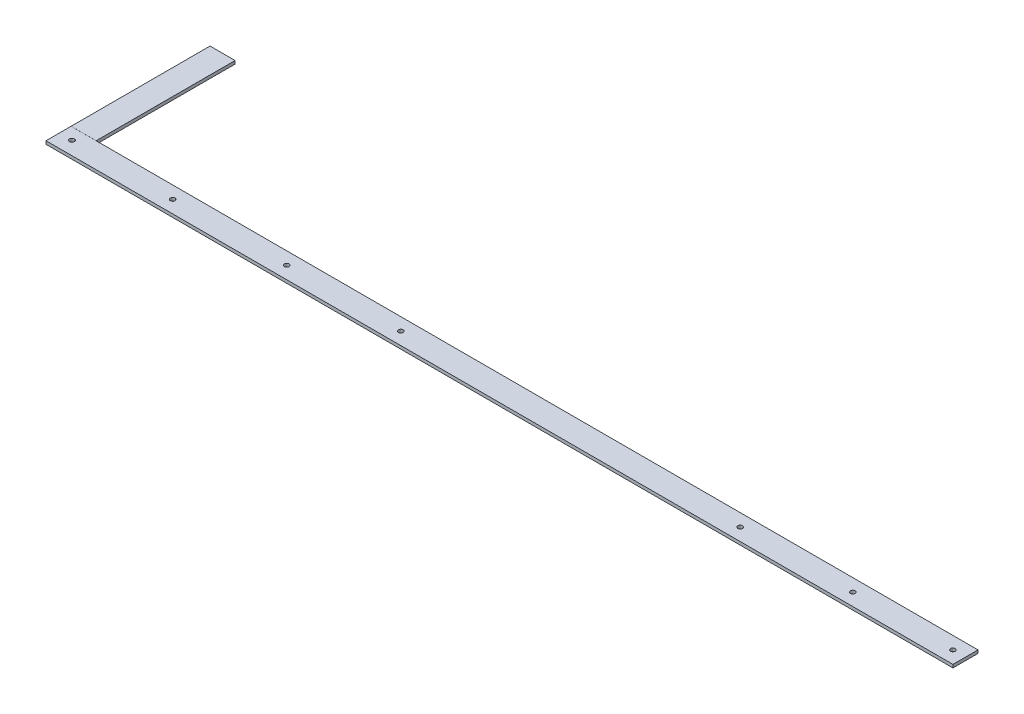
ISO-10303-21;
HEADER;
FILE_DESCRIPTION(('STEP AP214'),'2;1');
FILE_NAME('part.step','',(''),(''),'','','');
FILE_SCHEMA(('AUTOMOTIVE_DESIGN { 1 0 10303 214 1 1 1 1 }'));
ENDSEC;
DATA;
#1=APPLICATION_CONTEXT('core data for automotive mechanical design processes');
#2=APPLICATION_PROTOCOL_DEFINITION('international standard','automotive_design',2000,#1);
#3=PRODUCT_CONTEXT('',#1,'mechanical');
#4=PRODUCT('Part','Part','',(#3));
#5=PRODUCT_RELATED_PRODUCT_CATEGORY('part','',(#4));
#6=PRODUCT_DEFINITION_FORMATION('','',#4);
#7=PRODUCT_DEFINITION_CONTEXT('part definition',#1,'design');
#8=PRODUCT_DEFINITION('design','',#6,#7);
#9=PRODUCT_DEFINITION_SHAPE('','',#8);
#10=(LENGTH_UNIT() NAMED_UNIT(*) SI_UNIT(.MILLI.,.METRE.));
#11=(NAMED_UNIT(*) PLANE_ANGLE_UNIT() SI_UNIT($,.RADIAN.));
#12=(NAMED_UNIT(*) SI_UNIT($,.STERADIAN.) SOLID_ANGLE_UNIT());
#13=UNCERTAINTY_MEASURE_WITH_UNIT(LENGTH_MEASURE(1.E-05),#10,'distance_accuracy_value','');
#14=(GEOMETRIC_REPRESENTATION_CONTEXT(3) GLOBAL_UNCERTAINTY_ASSIGNED_CONTEXT((#13)) GLOBAL_UNIT_ASSIGNED_CONTEXT((#10,
#11,#12)) REPRESENTATION_CONTEXT('',''));
#15=CARTESIAN_POINT('',(0.,0.,0.));
#16=DIRECTION('',(0.,0.,1.));
#17=DIRECTION('',(1.,0.,0.));
#18=AXIS2_PLACEMENT_3D('',#15,#16,#17);
#19=CARTESIAN_POINT('',(-25.4,-64.345,6.31));
#20=DIRECTION('',(0.,1.,0.));
#21=DIRECTION('',(0.,0.,1.));
#22=AXIS2_PLACEMENT_3D('',#19,#20,#21);
#23=PLANE('',#22);
#24=CARTESIAN_POINT('',(1356.13785736519,-64.345,488.04));
#25=DIRECTION('',(0.,1.,0.));
#26=DIRECTION('',(0.,0.,1.));
#27=AXIS2_PLACEMENT_3D('',#24,#25,#26);
#28=CIRCLE('',#27,4.765);
#29=CARTESIAN_POINT('',(1356.13785736519,-64.345,492.805));
#30=VERTEX_POINT('',#29);
#31=EDGE_CURVE('E136',#30,#30,#28,.T.);
#32=ORIENTED_EDGE('',*,*,#31,.T.);
#33=EDGE_LOOP('',(#32));
#34=FACE_BOUND('',#33,.T.);
#35=CARTESIAN_POINT('',(668.331786047783,-64.345,488.04));
#36=DIRECTION('',(0.,1.,0.));
#37=DIRECTION('',(0.,0.,1.));
#38=AXIS2_PLACEMENT_3D('',#35,#36,#37);
#39=CIRCLE('',#38,4.76500000000001);
#40=CARTESIAN_POINT('',(668.331786047783,-64.345,492.805));
#41=VERTEX_POINT('',#40);
#42=EDGE_CURVE('E139',#41,#41,#39,.T.);
#43=ORIENTED_EDGE('',*,*,#42,.T.);
#44=EDGE_LOOP('',(#43));
#45=FACE_BOUND('',#44,.T.);
#46=CARTESIAN_POINT('',(437.087857365189,-64.345,488.04));
#47=DIRECTION('',(0.,1.,0.));
#48=DIRECTION('',(0.,0.,1.));
#49=AXIS2_PLACEMENT_3D('',#46,#47,#48);
#50=CIRCLE('',#49,4.76500000000001);
#51=CARTESIAN_POINT('',(437.087857365189,-64.345,492.805));
#52=VERTEX_POINT('',#51);
#53=EDGE_CURVE('E142',#52,#52,#50,.T.);
#54=ORIENTED_EDGE('',*,*,#53,.T.);
#55=EDGE_LOOP('',(#54));
#56=FACE_BOUND('',#55,.T.);
#57=CARTESIAN_POINT('',(205.843928682594,-64.345,488.04));
#58=DIRECTION('',(0.,1.,0.));
#59=DIRECTION('',(0.,0.,1.));
#60=AXIS2_PLACEMENT_3D('',#57,#58,#59);
#61=CIRCLE('',#60,4.76250000000001);
#62=CARTESIAN_POINT('',(205.843928682594,-64.345,492.8025));
#63=VERTEX_POINT('',#62);
#64=EDGE_CURVE('E145',#63,#63,#61,.T.);
#65=ORIENTED_EDGE('',*,*,#64,.T.);
#66=EDGE_LOOP('',(#65));
#67=FACE_BOUND('',#66,.T.);
#68=CARTESIAN_POINT('',(1584.41892868259,-64.345,488.04));
#69=DIRECTION('',(0.,1.,0.));
#70=DIRECTION('',(0.,0.,1.));
#71=AXIS2_PLACEMENT_3D('',#68,#69,#70);
#72=CIRCLE('',#71,4.765);
#73=CARTESIAN_POINT('',(1584.41892868259,-64.345,492.805));
#74=VERTEX_POINT('',#73);
#75=EDGE_CURVE('E130',#74,#74,#72,.T.);
#76=ORIENTED_EDGE('',*,*,#75,.T.);
#77=EDGE_LOOP('',(#76));
#78=FACE_BOUND('',#77,.T.);
#79=CARTESIAN_POINT('',(0.,-64.345,486.34));
#80=DIRECTION('',(0.,1.,0.));
#81=DIRECTION('',(0.,0.,1.));
#82=AXIS2_PLACEMENT_3D('',#79,#80,#81);
#83=CIRCLE('',#82,5.);
#84=CARTESIAN_POINT('',(0.,-64.345,491.34));
#85=VERTEX_POINT('',#84);
#86=EDGE_CURVE('E124',#85,#85,#83,.T.);
#87=ORIENTED_EDGE('',*,*,#86,.T.);
#88=EDGE_LOOP('',(#87));
#89=FACE_BOUND('',#88,.T.);
#90=CARTESIAN_POINT('',(1787.3,-64.345,488.04));
#91=DIRECTION('',(0.,1.,0.));
#92=DIRECTION('',(0.,0.,1.));
#93=AXIS2_PLACEMENT_3D('',#90,#91,#92);
#94=CIRCLE('',#93,4.7624999999999);
#95=CARTESIAN_POINT('',(1787.3,-64.345,492.8025));
#96=VERTEX_POINT('',#95);
#97=EDGE_CURVE('E118',#96,#96,#94,.T.);
#98=ORIENTED_EDGE('',*,*,#97,.T.);
#99=EDGE_LOOP('',(#98));
#100=FACE_BOUND('',#99,.T.);
#101=DIRECTION('',(0.,0.,-1.));
#102=VECTOR('',#101,1.);
#103=CARTESIAN_POINT('',(-25.4,-64.345,6.31));
#104=LINE('',#103,#102);
#105=CARTESIAN_POINT('',(-25.4,-64.345,513.44));
#106=VERTEX_POINT('',#105);
#107=CARTESIAN_POINT('',(-25.4,-64.345,462.64));
#108=VERTEX_POINT('',#107);
#109=EDGE_CURVE('E48',#106,#108,#104,.T.);
#110=ORIENTED_EDGE('',*,*,#109,.T.);
#111=DIRECTION('',(1.,0.,0.));
#112=VECTOR('',#111,1.);
#113=CARTESIAN_POINT('',(-25.4,-64.345,462.64));
#114=LINE('',#113,#112);
#115=CARTESIAN_POINT('',(1812.7,-64.3449999999998,462.64));
#116=VERTEX_POINT('',#115);
#117=EDGE_CURVE('E61',#108,#116,#114,.T.);
#118=ORIENTED_EDGE('',*,*,#117,.T.);
#119=DIRECTION('',(0.,0.,-1.));
#120=VECTOR('',#119,1.);
#121=CARTESIAN_POINT('',(1812.7,-64.3449999999998,462.64));
#122=LINE('',#121,#120);
#123=CARTESIAN_POINT('',(1812.7,-64.3449999999998,513.44));
#124=VERTEX_POINT('',#123);
#125=EDGE_CURVE('E105',#124,#116,#122,.T.);
#126=ORIENTED_EDGE('',*,*,#125,.F.);
#127=DIRECTION('',(-1.,0.,0.));
#128=VECTOR('',#127,1.);
#129=CARTESIAN_POINT('',(-25.4,-64.345,513.44));
#130=LINE('',#129,#128);
#131=EDGE_CURVE('E94',#124,#106,#130,.T.);
#132=ORIENTED_EDGE('',*,*,#131,.T.);
#133=EDGE_LOOP('',(#110,#118,#126,#132));
#134=FACE_BOUND('',#133,.T.);
#135=ADVANCED_FACE('F45',(#34,#45,#56,#67,#78,#89,#100,#134),#23,.F.);
#136=CARTESIAN_POINT('',(-25.4,-58.035,513.44));
#137=DIRECTION('',(0.,-1.,0.));
#138=DIRECTION('',(0.,0.,-1.));
#139=AXIS2_PLACEMENT_3D('',#136,#137,#138);
#140=PLANE('',#139);
#141=CARTESIAN_POINT('',(1356.13785736519,-58.035,488.04));
#142=DIRECTION('',(0.,1.,0.));
#143=DIRECTION('',(0.,0.,1.));
#144=AXIS2_PLACEMENT_3D('',#141,#142,#143);
#145=CIRCLE('',#144,4.765);
#146=CARTESIAN_POINT('',(1356.13785736519,-58.035,492.805));
#147=VERTEX_POINT('',#146);
#148=EDGE_CURVE('E148',#147,#147,#145,.T.);
#149=ORIENTED_EDGE('',*,*,#148,.F.);
#150=EDGE_LOOP('',(#149));
#151=FACE_BOUND('',#150,.T.);
#152=CARTESIAN_POINT('',(668.331786047783,-58.035,488.04));
#153=DIRECTION('',(0.,1.,0.));
#154=DIRECTION('',(0.,0.,1.));
#155=AXIS2_PLACEMENT_3D('',#152,#153,#154);
#156=CIRCLE('',#155,4.76500000000001);
#157=CARTESIAN_POINT('',(668.331786047783,-58.035,492.805));
#158=VERTEX_POINT('',#157);
#159=EDGE_CURVE('E155',#158,#158,#156,.T.);
#160=ORIENTED_EDGE('',*,*,#159,.F.);
#161=EDGE_LOOP('',(#160));
#162=FACE_BOUND('',#161,.T.);
#163=CARTESIAN_POINT('',(437.087857365189,-58.035,488.04));
#164=DIRECTION('',(0.,1.,0.));
#165=DIRECTION('',(0.,0.,1.));
#166=AXIS2_PLACEMENT_3D('',#163,#164,#165);
#167=CIRCLE('',#166,4.76500000000001);
#168=CARTESIAN_POINT('',(437.087857365189,-58.035,492.805));
#169=VERTEX_POINT('',#168);
#170=EDGE_CURVE('E152',#169,#169,#167,.T.);
#171=ORIENTED_EDGE('',*,*,#170,.F.);
#172=EDGE_LOOP('',(#171));
#173=FACE_BOUND('',#172,.T.);
#174=CARTESIAN_POINT('',(205.843928682594,-58.035,488.04));
#175=DIRECTION('',(0.,1.,0.));
#176=DIRECTION('',(0.,0.,1.));
#177=AXIS2_PLACEMENT_3D('',#174,#175,#176);
#178=CIRCLE('',#177,4.76250000000001);
#179=CARTESIAN_POINT('',(205.843928682594,-58.035,492.8025));
#180=VERTEX_POINT('',#179);
#181=EDGE_CURVE('E149',#180,#180,#178,.T.);
#182=ORIENTED_EDGE('',*,*,#181,.F.);
#183=EDGE_LOOP('',(#182));
#184=FACE_BOUND('',#183,.T.);
#185=CARTESIAN_POINT('',(1584.41892868259,-58.035,488.04));
#186=DIRECTION('',(0.,1.,0.));
#187=DIRECTION('',(0.,0.,1.));
#188=AXIS2_PLACEMENT_3D('',#185,#186,#187);
#189=CIRCLE('',#188,4.765);
#190=CARTESIAN_POINT('',(1584.41892868259,-58.035,492.805));
#191=VERTEX_POINT('',#190);
#192=EDGE_CURVE('E133',#191,#191,#189,.T.);
#193=ORIENTED_EDGE('',*,*,#192,.F.);
#194=EDGE_LOOP('',(#193));
#195=FACE_BOUND('',#194,.T.);
#196=CARTESIAN_POINT('',(0.,-58.035,486.34));
#197=DIRECTION('',(0.,1.,0.));
#198=DIRECTION('',(0.,0.,1.));
#199=AXIS2_PLACEMENT_3D('',#196,#197,#198);
#200=CIRCLE('',#199,5.);
#201=CARTESIAN_POINT('',(0.,-58.035,491.34));
#202=VERTEX_POINT('',#201);
#203=EDGE_CURVE('E127',#202,#202,#200,.T.);
#204=ORIENTED_EDGE('',*,*,#203,.F.);
#205=EDGE_LOOP('',(#204));
#206=FACE_BOUND('',#205,.T.);
#207=CARTESIAN_POINT('',(1787.3,-58.035,488.04));
#208=DIRECTION('',(0.,1.,0.));
#209=DIRECTION('',(0.,0.,1.));
#210=AXIS2_PLACEMENT_3D('',#207,#208,#209);
#211=CIRCLE('',#210,4.7624999999999);
#212=CARTESIAN_POINT('',(1787.3,-58.035,492.8025));
#213=VERTEX_POINT('',#212);
#214=EDGE_CURVE('E121',#213,#213,#211,.T.);
#215=ORIENTED_EDGE('',*,*,#214,.F.);
#216=EDGE_LOOP('',(#215));
#217=FACE_BOUND('',#216,.T.);
#218=DIRECTION('',(-1.,0.,0.));
#219=VECTOR('',#218,1.);
#220=CARTESIAN_POINT('',(1812.7,-58.0349999999998,462.64));
#221=LINE('',#220,#219);
#222=CARTESIAN_POINT('',(1812.7,-58.0349999999998,462.64));
#223=VERTEX_POINT('',#222);
#224=CARTESIAN_POINT('',(-25.4,-58.035,462.64));
#225=VERTEX_POINT('',#224);
#226=EDGE_CURVE('E110',#223,#225,#221,.T.);
#227=ORIENTED_EDGE('',*,*,#226,.T.);
#228=DIRECTION('',(0.,0.,-1.));
#229=VECTOR('',#228,1.);
#230=CARTESIAN_POINT('',(-25.4,-58.035,513.44));
#231=LINE('',#230,#229);
#232=CARTESIAN_POINT('',(-25.4,-58.035,513.44));
#233=VERTEX_POINT('',#232);
#234=EDGE_CURVE('E88',#233,#225,#231,.T.);
#235=ORIENTED_EDGE('',*,*,#234,.F.);
#236=DIRECTION('',(-1.,0.,0.));
#237=VECTOR('',#236,1.);
#238=CARTESIAN_POINT('',(-25.4,-58.035,513.44));
#239=LINE('',#238,#237);
#240=CARTESIAN_POINT('',(1812.7,-58.035,513.44));
#241=VERTEX_POINT('',#240);
#242=EDGE_CURVE('E12',#241,#233,#239,.T.);
#243=ORIENTED_EDGE('',*,*,#242,.F.);
#244=DIRECTION('',(0.,0.,1.));
#245=VECTOR('',#244,1.);
#246=CARTESIAN_POINT('',(1812.7,-58.0349999999998,462.64));
#247=LINE('',#246,#245);
#248=EDGE_CURVE('E86',#223,#241,#247,.T.);
#249=ORIENTED_EDGE('',*,*,#248,.F.);
#250=EDGE_LOOP('',(#227,#235,#243,#249));
#251=FACE_BOUND('',#250,.T.);
#252=ADVANCED_FACE('F84',(#151,#162,#173,#184,#195,#206,#217,#251),#140,.F.);
#253=CARTESIAN_POINT('',(-25.4,64.345,6.31));
#254=DIRECTION('',(1.,0.,0.));
#255=DIRECTION('',(0.,1.,0.));
#256=AXIS2_PLACEMENT_3D('',#253,#254,#255);
#257=PLANE('',#256);
#258=ORIENTED_EDGE('',*,*,#234,.T.);
#259=DIRECTION('',(0.,-1.,0.));
#260=VECTOR('',#259,1.);
#261=CARTESIAN_POINT('',(-25.4,64.345,462.64));
#262=LINE('',#261,#260);
#263=EDGE_CURVE('E113',#225,#108,#262,.T.);
#264=ORIENTED_EDGE('',*,*,#263,.T.);
#265=ORIENTED_EDGE('',*,*,#109,.F.);
#266=DIRECTION('',(0.,-1.,0.));
#267=VECTOR('',#266,1.);
#268=CARTESIAN_POINT('',(-25.4,-58.035,513.44));
#269=LINE('',#268,#267);
#270=EDGE_CURVE('E98',#233,#106,#269,.T.);
#271=ORIENTED_EDGE('',*,*,#270,.F.);
#272=EDGE_LOOP('',(#258,#264,#265,#271));
#273=FACE_BOUND('',#272,.T.);
#274=ADVANCED_FACE('F166',(#273),#257,.F.);
#275=CARTESIAN_POINT('',(1812.7,1.97302717093577E-13,0.));
#276=DIRECTION('',(1.,0.,0.));
#277=DIRECTION('',(0.,0.,-1.));
#278=AXIS2_PLACEMENT_3D('',#275,#276,#277);
#279=PLANE('',#278);
#280=DIRECTION('',(0.,1.,0.));
#281=VECTOR('',#280,1.);
#282=CARTESIAN_POINT('',(1812.7,-108.835,513.44));
#283=LINE('',#282,#281);
#284=EDGE_CURVE('E54',#124,#241,#283,.T.);
#285=ORIENTED_EDGE('',*,*,#284,.F.);
#286=ORIENTED_EDGE('',*,*,#125,.T.);
#287=DIRECTION('',(0.,1.,0.));
#288=VECTOR('',#287,1.);
#289=CARTESIAN_POINT('',(1812.7,-64.3449999999998,462.64));
#290=LINE('',#289,#288);
#291=EDGE_CURVE('E101',#116,#223,#290,.T.);
#292=ORIENTED_EDGE('',*,*,#291,.T.);
#293=ORIENTED_EDGE('',*,*,#248,.T.);
#294=EDGE_LOOP('',(#285,#286,#292,#293));
#295=FACE_BOUND('',#294,.T.);
#296=ADVANCED_FACE('F100',(#295),#279,.T.);
#297=CARTESIAN_POINT('',(0.,0.,513.44));
#298=DIRECTION('',(0.,0.,1.));
#299=DIRECTION('',(1.,0.,0.));
#300=AXIS2_PLACEMENT_3D('',#297,#298,#299);
#301=PLANE('',#300);
#302=ORIENTED_EDGE('',*,*,#270,.T.);
#303=ORIENTED_EDGE('',*,*,#131,.F.);
#304=ORIENTED_EDGE('',*,*,#284,.T.);
#305=ORIENTED_EDGE('',*,*,#242,.T.);
#306=EDGE_LOOP('',(#302,#303,#304,#305));
#307=FACE_BOUND('',#306,.T.);
#308=ADVANCED_FACE('F93',(#307),#301,.T.);
#309=CARTESIAN_POINT('',(1812.7,-64.3449999999998,462.64));
#310=DIRECTION('',(0.,0.,1.));
#311=DIRECTION('',(1.,0.,0.));
#312=AXIS2_PLACEMENT_3D('',#309,#310,#311);
#313=PLANE('',#312);
#314=ORIENTED_EDGE('',*,*,#291,.F.);
#315=ORIENTED_EDGE('',*,*,#117,.F.);
#316=ORIENTED_EDGE('',*,*,#263,.F.);
#317=ORIENTED_EDGE('',*,*,#226,.F.);
#318=EDGE_LOOP('',(#314,#315,#316,#317));
#319=FACE_BOUND('',#318,.T.);
#320=ADVANCED_FACE('F183',(#319),#313,.F.);
#321=CARTESIAN_POINT('',(1787.3,-91.035,488.04));
#322=DIRECTION('',(0.,1.,0.));
#323=DIRECTION('',(0.,0.,1.));
#324=AXIS2_PLACEMENT_3D('',#321,#322,#323);
#325=CYLINDRICAL_SURFACE('',#324,4.7624999999999);
#326=ORIENTED_EDGE('',*,*,#214,.T.);
#327=EDGE_LOOP('',(#326));
#328=FACE_BOUND('',#327,.T.);
#329=ORIENTED_EDGE('',*,*,#97,.F.);
#330=EDGE_LOOP('',(#329));
#331=FACE_BOUND('',#330,.T.);
#332=ADVANCED_FACE('F179',(#328,#331),#325,.F.);
#333=CARTESIAN_POINT('',(0.,-108.035,486.34));
#334=DIRECTION('',(0.,1.,0.));
#335=DIRECTION('',(0.,0.,1.));
#336=AXIS2_PLACEMENT_3D('',#333,#334,#335);
#337=CYLINDRICAL_SURFACE('',#336,5.);
#338=ORIENTED_EDGE('',*,*,#203,.T.);
#339=EDGE_LOOP('',(#338));
#340=FACE_BOUND('',#339,.T.);
#341=ORIENTED_EDGE('',*,*,#86,.F.);
#342=EDGE_LOOP('',(#341));
#343=FACE_BOUND('',#342,.T.);
#344=ADVANCED_FACE('F182',(#340,#343),#337,.F.);
#345=CARTESIAN_POINT('',(1584.41892868259,-68.035,488.04));
#346=DIRECTION('',(0.,1.,0.));
#347=DIRECTION('',(0.,0.,1.));
#348=AXIS2_PLACEMENT_3D('',#345,#346,#347);
#349=CYLINDRICAL_SURFACE('',#348,4.765);
#350=ORIENTED_EDGE('',*,*,#192,.T.);
#351=EDGE_LOOP('',(#350));
#352=FACE_BOUND('',#351,.T.);
#353=ORIENTED_EDGE('',*,*,#75,.F.);
#354=EDGE_LOOP('',(#353));
#355=FACE_BOUND('',#354,.T.);
#356=ADVANCED_FACE('F203',(#352,#355),#349,.F.);
#357=CARTESIAN_POINT('',(205.843928682594,-68.035,488.04));
#358=DIRECTION('',(0.,1.,0.));
#359=DIRECTION('',(0.,0.,1.));
#360=AXIS2_PLACEMENT_3D('',#357,#358,#359);
#361=CYLINDRICAL_SURFACE('',#360,4.76250000000001);
#362=ORIENTED_EDGE('',*,*,#181,.T.);
#363=EDGE_LOOP('',(#362));
#364=FACE_BOUND('',#363,.T.);
#365=ORIENTED_EDGE('',*,*,#64,.F.);
#366=EDGE_LOOP('',(#365));
#367=FACE_BOUND('',#366,.T.);
#368=ADVANCED_FACE('F207',(#364,#367),#361,.F.);
#369=CARTESIAN_POINT('',(437.087857365189,-68.035,488.04));
#370=DIRECTION('',(0.,1.,0.));
#371=DIRECTION('',(0.,0.,1.));
#372=AXIS2_PLACEMENT_3D('',#369,#370,#371);
#373=CYLINDRICAL_SURFACE('',#372,4.76500000000001);
#374=ORIENTED_EDGE('',*,*,#170,.T.);
#375=EDGE_LOOP('',(#374));
#376=FACE_BOUND('',#375,.T.);
#377=ORIENTED_EDGE('',*,*,#53,.F.);
#378=EDGE_LOOP('',(#377));
#379=FACE_BOUND('',#378,.T.);
#380=ADVANCED_FACE('F211',(#376,#379),#373,.F.);
#381=CARTESIAN_POINT('',(668.331786047783,-68.035,488.04));
#382=DIRECTION('',(0.,1.,0.));
#383=DIRECTION('',(0.,0.,1.));
#384=AXIS2_PLACEMENT_3D('',#381,#382,#383);
#385=CYLINDRICAL_SURFACE('',#384,4.76500000000001);
#386=ORIENTED_EDGE('',*,*,#159,.T.);
#387=EDGE_LOOP('',(#386));
#388=FACE_BOUND('',#387,.T.);
#389=ORIENTED_EDGE('',*,*,#42,.F.);
#390=EDGE_LOOP('',(#389));
#391=FACE_BOUND('',#390,.T.);
#392=ADVANCED_FACE('F215',(#388,#391),#385,.F.);
#393=CARTESIAN_POINT('',(1356.13785736519,-68.035,488.04));
#394=DIRECTION('',(0.,1.,0.));
#395=DIRECTION('',(0.,0.,1.));
#396=AXIS2_PLACEMENT_3D('',#393,#394,#395);
#397=CYLINDRICAL_SURFACE('',#396,4.765);
#398=ORIENTED_EDGE('',*,*,#148,.T.);
#399=EDGE_LOOP('',(#398));
#400=FACE_BOUND('',#399,.T.);
#401=ORIENTED_EDGE('',*,*,#31,.F.);
#402=EDGE_LOOP('',(#401));
#403=FACE_BOUND('',#402,.T.);
#404=ADVANCED_FACE('F161',(#400,#403),#397,.F.);
#405=CLOSED_SHELL('',(#135,#252,#274,#296,#308,#320,#332,#344,#356,#368,#380,#392,#404));
#406=MANIFOLD_SOLID_BREP('B2',#405);
#407=CARTESIAN_POINT('',(25.4,64.345,6.31));
#408=DIRECTION('',(-1.,0.,0.));
#409=DIRECTION('',(0.,-1.,0.));
#410=AXIS2_PLACEMENT_3D('',#407,#408,#409);
#411=PLANE('',#410);
#412=DIRECTION('',(0.,0.,-1.));
#413=VECTOR('',#412,1.);
#414=CARTESIAN_POINT('',(25.4,-64.345,6.31));
#415=LINE('',#414,#413);
#416=CARTESIAN_POINT('',(25.4,-64.345,462.54));
#417=VERTEX_POINT('',#416);
#418=CARTESIAN_POINT('',(25.4,-64.345,181.));
#419=VERTEX_POINT('',#418);
#420=EDGE_CURVE('E405',#417,#419,#415,.T.);
#421=ORIENTED_EDGE('',*,*,#420,.T.);
#422=DIRECTION('',(0.,1.,0.));
#423=VECTOR('',#422,1.);
#424=CARTESIAN_POINT('',(25.4,-132.035,181.));
#425=LINE('',#424,#423);
#426=CARTESIAN_POINT('',(25.4,-58.035,181.));
#427=VERTEX_POINT('',#426);
#428=EDGE_CURVE('E364',#419,#427,#425,.T.);
#429=ORIENTED_EDGE('',*,*,#428,.T.);
#430=DIRECTION('',(0.,0.,-1.));
#431=VECTOR('',#430,1.);
#432=CARTESIAN_POINT('',(25.4,-58.035,513.44));
#433=LINE('',#432,#431);
#434=CARTESIAN_POINT('',(25.4,-58.035,462.54));
#435=VERTEX_POINT('',#434);
#436=EDGE_CURVE('E402',#435,#427,#433,.T.);
#437=ORIENTED_EDGE('',*,*,#436,.F.);
#438=DIRECTION('',(0.,1.,0.));
#439=VECTOR('',#438,1.);
#440=CARTESIAN_POINT('',(25.4,-108.835,462.54));
#441=LINE('',#440,#439);
#442=EDGE_CURVE('E416',#417,#435,#441,.T.);
#443=ORIENTED_EDGE('',*,*,#442,.F.);
#444=EDGE_LOOP('',(#421,#429,#437,#443));
#445=FACE_BOUND('',#444,.T.);
#446=ADVANCED_FACE('F349',(#445),#411,.F.);
#447=CARTESIAN_POINT('',(-25.4,64.345,6.31));
#448=DIRECTION('',(1.,0.,0.));
#449=DIRECTION('',(0.,1.,0.));
#450=AXIS2_PLACEMENT_3D('',#447,#448,#449);
#451=PLANE('',#450);
#452=DIRECTION('',(0.,0.,-1.));
#453=VECTOR('',#452,1.);
#454=CARTESIAN_POINT('',(-25.4,-58.035,513.44));
#455=LINE('',#454,#453);
#456=CARTESIAN_POINT('',(-25.4,-58.035,462.54));
#457=VERTEX_POINT('',#456);
#458=CARTESIAN_POINT('',(-25.4,-58.035,181.));
#459=VERTEX_POINT('',#458);
#460=EDGE_CURVE('E400',#457,#459,#455,.T.);
#461=ORIENTED_EDGE('',*,*,#460,.T.);
#462=DIRECTION('',(0.,1.,0.));
#463=VECTOR('',#462,1.);
#464=CARTESIAN_POINT('',(-25.4,-132.035,181.));
#465=LINE('',#464,#463);
#466=CARTESIAN_POINT('',(-25.4,-64.345,181.));
#467=VERTEX_POINT('',#466);
#468=EDGE_CURVE('E387',#467,#459,#465,.T.);
#469=ORIENTED_EDGE('',*,*,#468,.F.);
#470=DIRECTION('',(0.,0.,-1.));
#471=VECTOR('',#470,1.);
#472=CARTESIAN_POINT('',(-25.4,-64.345,6.31));
#473=LINE('',#472,#471);
#474=CARTESIAN_POINT('',(-25.4,-64.345,462.54));
#475=VERTEX_POINT('',#474);
#476=EDGE_CURVE('E410',#475,#467,#473,.T.);
#477=ORIENTED_EDGE('',*,*,#476,.F.);
#478=DIRECTION('',(0.,1.,0.));
#479=VECTOR('',#478,1.);
#480=CARTESIAN_POINT('',(-25.4,64.345,462.54));
#481=LINE('',#480,#479);
#482=EDGE_CURVE('E357',#475,#457,#481,.T.);
#483=ORIENTED_EDGE('',*,*,#482,.T.);
#484=EDGE_LOOP('',(#461,#469,#477,#483));
#485=FACE_BOUND('',#484,.T.);
#486=ADVANCED_FACE('F404',(#485),#451,.F.);
#487=CARTESIAN_POINT('',(-25.4,-58.035,513.44));
#488=DIRECTION('',(0.,-1.,0.));
#489=DIRECTION('',(0.,0.,-1.));
#490=AXIS2_PLACEMENT_3D('',#487,#488,#489);
#491=PLANE('',#490);
#492=ORIENTED_EDGE('',*,*,#436,.T.);
#493=DIRECTION('',(1.,0.,0.));
#494=VECTOR('',#493,1.);
#495=CARTESIAN_POINT('',(-25.4,-58.035,181.));
#496=LINE('',#495,#494);
#497=EDGE_CURVE('E390',#459,#427,#496,.T.);
#498=ORIENTED_EDGE('',*,*,#497,.F.);
#499=ORIENTED_EDGE('',*,*,#460,.F.);
#500=DIRECTION('',(-1.,0.,0.));
#501=VECTOR('',#500,1.);
#502=CARTESIAN_POINT('',(-25.4,-58.035,462.54));
#503=LINE('',#502,#501);
#504=EDGE_CURVE('E371',#435,#457,#503,.T.);
#505=ORIENTED_EDGE('',*,*,#504,.F.);
#506=EDGE_LOOP('',(#492,#498,#499,#505));
#507=FACE_BOUND('',#506,.T.);
#508=ADVANCED_FACE('F399',(#507),#491,.F.);
#509=CARTESIAN_POINT('',(-25.4,-64.345,6.31));
#510=DIRECTION('',(0.,1.,0.));
#511=DIRECTION('',(0.,0.,1.));
#512=AXIS2_PLACEMENT_3D('',#509,#510,#511);
#513=PLANE('',#512);
#514=ORIENTED_EDGE('',*,*,#476,.T.);
#515=DIRECTION('',(1.,0.,0.));
#516=VECTOR('',#515,1.);
#517=CARTESIAN_POINT('',(-25.4,-64.345,181.));
#518=LINE('',#517,#516);
#519=EDGE_CURVE('E43',#467,#419,#518,.T.);
#520=ORIENTED_EDGE('',*,*,#519,.T.);
#521=ORIENTED_EDGE('',*,*,#420,.F.);
#522=DIRECTION('',(-1.,0.,0.));
#523=VECTOR('',#522,1.);
#524=CARTESIAN_POINT('',(-25.4,-64.345,462.54));
#525=LINE('',#524,#523);
#526=EDGE_CURVE('E413',#417,#475,#525,.T.);
#527=ORIENTED_EDGE('',*,*,#526,.T.);
#528=EDGE_LOOP('',(#514,#520,#521,#527));
#529=FACE_BOUND('',#528,.T.);
#530=ADVANCED_FACE('F351',(#529),#513,.F.);
#531=CARTESIAN_POINT('',(-25.4,-108.835,462.54));
#532=DIRECTION('',(0.,0.,-1.));
#533=DIRECTION('',(-1.,0.,0.));
#534=AXIS2_PLACEMENT_3D('',#531,#532,#533);
#535=PLANE('',#534);
#536=ORIENTED_EDGE('',*,*,#442,.T.);
#537=ORIENTED_EDGE('',*,*,#504,.T.);
#538=ORIENTED_EDGE('',*,*,#482,.F.);
#539=ORIENTED_EDGE('',*,*,#526,.F.);
#540=EDGE_LOOP('',(#536,#537,#538,#539));
#541=FACE_BOUND('',#540,.T.);
#542=ADVANCED_FACE('F423',(#541),#535,.F.);
#543=CARTESIAN_POINT('',(-25.4,-132.035,181.));
#544=DIRECTION('',(0.,0.,1.));
#545=DIRECTION('',(1.,0.,0.));
#546=AXIS2_PLACEMENT_3D('',#543,#544,#545);
#547=PLANE('',#546);
#548=ORIENTED_EDGE('',*,*,#468,.T.);
#549=ORIENTED_EDGE('',*,*,#497,.T.);
#550=ORIENTED_EDGE('',*,*,#428,.F.);
#551=ORIENTED_EDGE('',*,*,#519,.F.);
#552=EDGE_LOOP('',(#548,#549,#550,#551));
#553=FACE_BOUND('',#552,.T.);
#554=ADVANCED_FACE('F389',(#553),#547,.F.);
#555=CLOSED_SHELL('',(#446,#486,#508,#530,#542,#554));
#556=MANIFOLD_SOLID_BREP('B6',#555);
#557=ADVANCED_BREP_SHAPE_REPRESENTATION('',(#18,#406,#556),#14);
#558=SHAPE_DEFINITION_REPRESENTATION(#9,#557);
ENDSEC;
END-ISO-10303-21;
